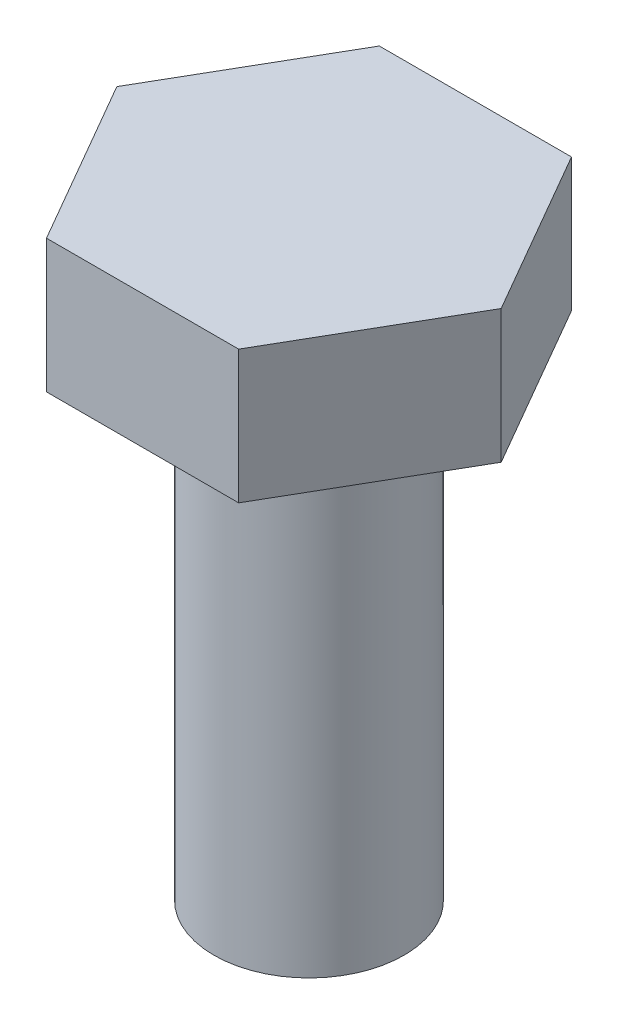
ISO-10303-21;
HEADER;
FILE_DESCRIPTION(('STEP AP214'),'2;1');
FILE_NAME('part.step','',(''),(''),'','','');
FILE_SCHEMA(('AUTOMOTIVE_DESIGN { 1 0 10303 214 1 1 1 1 }'));
ENDSEC;
DATA;
#1=APPLICATION_CONTEXT('core data for automotive mechanical design processes');
#2=APPLICATION_PROTOCOL_DEFINITION('international standard','automotive_design',2000,#1);
#3=PRODUCT_CONTEXT('',#1,'mechanical');
#4=PRODUCT('Part','Part','',(#3));
#5=PRODUCT_RELATED_PRODUCT_CATEGORY('part','',(#4));
#6=PRODUCT_DEFINITION_FORMATION('','',#4);
#7=PRODUCT_DEFINITION_CONTEXT('part definition',#1,'design');
#8=PRODUCT_DEFINITION('design','',#6,#7);
#9=PRODUCT_DEFINITION_SHAPE('','',#8);
#10=(LENGTH_UNIT() NAMED_UNIT(*) SI_UNIT(.MILLI.,.METRE.));
#11=(NAMED_UNIT(*) PLANE_ANGLE_UNIT() SI_UNIT($,.RADIAN.));
#12=(NAMED_UNIT(*) SI_UNIT($,.STERADIAN.) SOLID_ANGLE_UNIT());
#13=UNCERTAINTY_MEASURE_WITH_UNIT(LENGTH_MEASURE(1.E-05),#10,'distance_accuracy_value','');
#14=(GEOMETRIC_REPRESENTATION_CONTEXT(3) GLOBAL_UNCERTAINTY_ASSIGNED_CONTEXT((#13)) GLOBAL_UNIT_ASSIGNED_CONTEXT((#10,
#11,#12)) REPRESENTATION_CONTEXT('',''));
#15=CARTESIAN_POINT('',(0.,0.,0.));
#16=DIRECTION('',(0.,0.,1.));
#17=DIRECTION('',(1.,0.,0.));
#18=AXIS2_PLACEMENT_3D('',#15,#16,#17);
#19=CARTESIAN_POINT('',(0.,10.,0.));
#20=DIRECTION('',(0.,-1.,0.));
#21=DIRECTION('',(0.,0.,-1.));
#22=AXIS2_PLACEMENT_3D('',#19,#20,#21);
#23=CYLINDRICAL_SURFACE('',#22,2.);
#24=CARTESIAN_POINT('',(0.,10.,0.));
#25=DIRECTION('',(0.,1.,0.));
#26=DIRECTION('',(0.,0.,1.));
#27=AXIS2_PLACEMENT_3D('',#24,#25,#26);
#28=CIRCLE('',#27,2.);
#29=CARTESIAN_POINT('',(0.,10.,2.));
#30=VERTEX_POINT('',#29);
#31=EDGE_CURVE('E11',#30,#30,#28,.T.);
#32=ORIENTED_EDGE('',*,*,#31,.F.);
#33=EDGE_LOOP('',(#32));
#34=FACE_BOUND('',#33,.T.);
#35=CARTESIAN_POINT('',(0.,0.,0.));
#36=DIRECTION('',(0.,1.,0.));
#37=DIRECTION('',(0.,0.,1.));
#38=AXIS2_PLACEMENT_3D('',#35,#36,#37);
#39=CIRCLE('',#38,2.);
#40=CARTESIAN_POINT('',(0.,0.,2.));
#41=VERTEX_POINT('',#40);
#42=EDGE_CURVE('E37',#41,#41,#39,.T.);
#43=ORIENTED_EDGE('',*,*,#42,.T.);
#44=EDGE_LOOP('',(#43));
#45=FACE_BOUND('',#44,.T.);
#46=ADVANCED_FACE('F34',(#34,#45),#23,.T.);
#47=CARTESIAN_POINT('',(0.,0.,0.));
#48=DIRECTION('',(0.,1.,0.));
#49=DIRECTION('',(0.,0.,1.));
#50=AXIS2_PLACEMENT_3D('',#47,#48,#49);
#51=PLANE('',#50);
#52=ORIENTED_EDGE('',*,*,#42,.F.);
#53=EDGE_LOOP('',(#52));
#54=FACE_BOUND('',#53,.T.);
#55=ADVANCED_FACE('F142',(#54),#51,.F.);
#56=CARTESIAN_POINT('',(2.02072594216369,12.8,3.5));
#57=DIRECTION('',(-0.866025403784439,0.,-0.5));
#58=DIRECTION('',(-0.5,0.,0.866025403784439));
#59=AXIS2_PLACEMENT_3D('',#56,#57,#58);
#60=PLANE('',#59);
#61=DIRECTION('',(0.5,0.,-0.866025403784439));
#62=VECTOR('',#61,1.);
#63=CARTESIAN_POINT('',(2.02072594216369,10.,3.5));
#64=LINE('',#63,#62);
#65=CARTESIAN_POINT('',(2.02072594216369,10.,3.5));
#66=VERTEX_POINT('',#65);
#67=CARTESIAN_POINT('',(4.04145188432738,10.,0.));
#68=VERTEX_POINT('',#67);
#69=EDGE_CURVE('E119',#66,#68,#64,.T.);
#70=ORIENTED_EDGE('',*,*,#69,.T.);
#71=DIRECTION('',(0.,-1.,0.));
#72=VECTOR('',#71,1.);
#73=CARTESIAN_POINT('',(4.04145188432738,12.8,0.));
#74=LINE('',#73,#72);
#75=CARTESIAN_POINT('',(4.04145188432738,12.8,0.));
#76=VERTEX_POINT('',#75);
#77=EDGE_CURVE('E136',#76,#68,#74,.T.);
#78=ORIENTED_EDGE('',*,*,#77,.F.);
#79=DIRECTION('',(0.5,0.,-0.866025403784439));
#80=VECTOR('',#79,1.);
#81=CARTESIAN_POINT('',(2.02072594216369,12.8,3.5));
#82=LINE('',#81,#80);
#83=CARTESIAN_POINT('',(2.02072594216369,12.8,3.5));
#84=VERTEX_POINT('',#83);
#85=EDGE_CURVE('E129',#84,#76,#82,.T.);
#86=ORIENTED_EDGE('',*,*,#85,.F.);
#87=DIRECTION('',(0.,-1.,0.));
#88=VECTOR('',#87,1.);
#89=CARTESIAN_POINT('',(2.02072594216369,12.8,3.5));
#90=LINE('',#89,#88);
#91=EDGE_CURVE('E115',#84,#66,#90,.T.);
#92=ORIENTED_EDGE('',*,*,#91,.T.);
#93=EDGE_LOOP('',(#70,#78,#86,#92));
#94=FACE_BOUND('',#93,.T.);
#95=ADVANCED_FACE('F144',(#94),#60,.F.);
#96=CARTESIAN_POINT('',(4.04145188432738,12.8,0.));
#97=DIRECTION('',(-0.866025403784438,0.,0.5));
#98=DIRECTION('',(0.5,0.,0.866025403784438));
#99=AXIS2_PLACEMENT_3D('',#96,#97,#98);
#100=PLANE('',#99);
#101=DIRECTION('',(-0.5,0.,-0.866025403784438));
#102=VECTOR('',#101,1.);
#103=CARTESIAN_POINT('',(4.04145188432738,10.,0.));
#104=LINE('',#103,#102);
#105=CARTESIAN_POINT('',(2.02072594216369,10.,-3.5));
#106=VERTEX_POINT('',#105);
#107=EDGE_CURVE('E122',#68,#106,#104,.T.);
#108=ORIENTED_EDGE('',*,*,#107,.T.);
#109=DIRECTION('',(0.,-1.,0.));
#110=VECTOR('',#109,1.);
#111=CARTESIAN_POINT('',(2.02072594216369,12.8,-3.5));
#112=LINE('',#111,#110);
#113=CARTESIAN_POINT('',(2.02072594216369,12.8,-3.5));
#114=VERTEX_POINT('',#113);
#115=EDGE_CURVE('E133',#114,#106,#112,.T.);
#116=ORIENTED_EDGE('',*,*,#115,.F.);
#117=DIRECTION('',(-0.5,0.,-0.866025403784438));
#118=VECTOR('',#117,1.);
#119=CARTESIAN_POINT('',(4.04145188432738,12.8,0.));
#120=LINE('',#119,#118);
#121=EDGE_CURVE('E88',#76,#114,#120,.T.);
#122=ORIENTED_EDGE('',*,*,#121,.F.);
#123=ORIENTED_EDGE('',*,*,#77,.T.);
#124=EDGE_LOOP('',(#108,#116,#122,#123));
#125=FACE_BOUND('',#124,.T.);
#126=ADVANCED_FACE('F149',(#125),#100,.F.);
#127=CARTESIAN_POINT('',(2.02072594216369,12.8,-3.5));
#128=DIRECTION('',(0.,0.,1.));
#129=DIRECTION('',(1.,0.,0.));
#130=AXIS2_PLACEMENT_3D('',#127,#128,#129);
#131=PLANE('',#130);
#132=DIRECTION('',(-1.,0.,0.));
#133=VECTOR('',#132,1.);
#134=CARTESIAN_POINT('',(2.02072594216369,10.,-3.5));
#135=LINE('',#134,#133);
#136=CARTESIAN_POINT('',(-2.02072594216369,10.,-3.5));
#137=VERTEX_POINT('',#136);
#138=EDGE_CURVE('E124',#106,#137,#135,.T.);
#139=ORIENTED_EDGE('',*,*,#138,.T.);
#140=DIRECTION('',(0.,-1.,0.));
#141=VECTOR('',#140,1.);
#142=CARTESIAN_POINT('',(-2.02072594216369,12.8,-3.5));
#143=LINE('',#142,#141);
#144=CARTESIAN_POINT('',(-2.02072594216369,12.8,-3.5));
#145=VERTEX_POINT('',#144);
#146=EDGE_CURVE('E110',#145,#137,#143,.T.);
#147=ORIENTED_EDGE('',*,*,#146,.F.);
#148=DIRECTION('',(-1.,0.,0.));
#149=VECTOR('',#148,1.);
#150=CARTESIAN_POINT('',(2.02072594216369,12.8,-3.5));
#151=LINE('',#150,#149);
#152=EDGE_CURVE('E101',#114,#145,#151,.T.);
#153=ORIENTED_EDGE('',*,*,#152,.F.);
#154=ORIENTED_EDGE('',*,*,#115,.T.);
#155=EDGE_LOOP('',(#139,#147,#153,#154));
#156=FACE_BOUND('',#155,.T.);
#157=ADVANCED_FACE('F156',(#156),#131,.F.);
#158=CARTESIAN_POINT('',(-2.02072594216369,12.8,-3.5));
#159=DIRECTION('',(0.866025403784439,0.,0.5));
#160=DIRECTION('',(0.5,0.,-0.866025403784439));
#161=AXIS2_PLACEMENT_3D('',#158,#159,#160);
#162=PLANE('',#161);
#163=DIRECTION('',(-0.5,0.,0.866025403784439));
#164=VECTOR('',#163,1.);
#165=CARTESIAN_POINT('',(-2.02072594216369,10.,-3.5));
#166=LINE('',#165,#164);
#167=CARTESIAN_POINT('',(-4.04145188432738,10.,0.));
#168=VERTEX_POINT('',#167);
#169=EDGE_CURVE('E109',#137,#168,#166,.T.);
#170=ORIENTED_EDGE('',*,*,#169,.T.);
#171=DIRECTION('',(0.,-1.,0.));
#172=VECTOR('',#171,1.);
#173=CARTESIAN_POINT('',(-4.04145188432738,12.8,0.));
#174=LINE('',#173,#172);
#175=CARTESIAN_POINT('',(-4.04145188432738,12.8,0.));
#176=VERTEX_POINT('',#175);
#177=EDGE_CURVE('E106',#176,#168,#174,.T.);
#178=ORIENTED_EDGE('',*,*,#177,.F.);
#179=DIRECTION('',(-0.5,0.,0.866025403784439));
#180=VECTOR('',#179,1.);
#181=CARTESIAN_POINT('',(-2.02072594216369,12.8,-3.5));
#182=LINE('',#181,#180);
#183=EDGE_CURVE('E95',#145,#176,#182,.T.);
#184=ORIENTED_EDGE('',*,*,#183,.F.);
#185=ORIENTED_EDGE('',*,*,#146,.T.);
#186=EDGE_LOOP('',(#170,#178,#184,#185));
#187=FACE_BOUND('',#186,.T.);
#188=ADVANCED_FACE('F107',(#187),#162,.F.);
#189=CARTESIAN_POINT('',(-4.04145188432738,12.8,0.));
#190=DIRECTION('',(0.866025403784439,0.,-0.5));
#191=DIRECTION('',(-0.5,0.,-0.866025403784439));
#192=AXIS2_PLACEMENT_3D('',#189,#190,#191);
#193=PLANE('',#192);
#194=DIRECTION('',(0.5,0.,0.866025403784439));
#195=VECTOR('',#194,1.);
#196=CARTESIAN_POINT('',(-4.04145188432738,10.,0.));
#197=LINE('',#196,#195);
#198=CARTESIAN_POINT('',(-2.02072594216369,10.,3.5));
#199=VERTEX_POINT('',#198);
#200=EDGE_CURVE('E73',#168,#199,#197,.T.);
#201=ORIENTED_EDGE('',*,*,#200,.T.);
#202=DIRECTION('',(0.,-1.,0.));
#203=VECTOR('',#202,1.);
#204=CARTESIAN_POINT('',(-2.02072594216369,12.8,3.5));
#205=LINE('',#204,#203);
#206=CARTESIAN_POINT('',(-2.02072594216369,12.8,3.5));
#207=VERTEX_POINT('',#206);
#208=EDGE_CURVE('E111',#207,#199,#205,.T.);
#209=ORIENTED_EDGE('',*,*,#208,.F.);
#210=DIRECTION('',(0.5,0.,0.866025403784439));
#211=VECTOR('',#210,1.);
#212=CARTESIAN_POINT('',(-4.04145188432738,12.8,0.));
#213=LINE('',#212,#211);
#214=EDGE_CURVE('E99',#176,#207,#213,.T.);
#215=ORIENTED_EDGE('',*,*,#214,.F.);
#216=ORIENTED_EDGE('',*,*,#177,.T.);
#217=EDGE_LOOP('',(#201,#209,#215,#216));
#218=FACE_BOUND('',#217,.T.);
#219=ADVANCED_FACE('F113',(#218),#193,.F.);
#220=CARTESIAN_POINT('',(-2.02072594216369,12.8,3.5));
#221=DIRECTION('',(0.,0.,-1.));
#222=DIRECTION('',(-1.,0.,0.));
#223=AXIS2_PLACEMENT_3D('',#220,#221,#222);
#224=PLANE('',#223);
#225=DIRECTION('',(1.,0.,0.));
#226=VECTOR('',#225,1.);
#227=CARTESIAN_POINT('',(-2.02072594216369,10.,3.5));
#228=LINE('',#227,#226);
#229=EDGE_CURVE('E79',#199,#66,#228,.T.);
#230=ORIENTED_EDGE('',*,*,#229,.T.);
#231=ORIENTED_EDGE('',*,*,#91,.F.);
#232=DIRECTION('',(1.,0.,0.));
#233=VECTOR('',#232,1.);
#234=CARTESIAN_POINT('',(-2.02072594216369,12.8,3.5));
#235=LINE('',#234,#233);
#236=EDGE_CURVE('E50',#207,#84,#235,.T.);
#237=ORIENTED_EDGE('',*,*,#236,.F.);
#238=ORIENTED_EDGE('',*,*,#208,.T.);
#239=EDGE_LOOP('',(#230,#231,#237,#238));
#240=FACE_BOUND('',#239,.T.);
#241=ADVANCED_FACE('F164',(#240),#224,.F.);
#242=CARTESIAN_POINT('',(0.,12.8,0.));
#243=DIRECTION('',(0.,1.,0.));
#244=DIRECTION('',(0.,0.,1.));
#245=AXIS2_PLACEMENT_3D('',#242,#243,#244);
#246=PLANE('',#245);
#247=ORIENTED_EDGE('',*,*,#85,.T.);
#248=ORIENTED_EDGE('',*,*,#121,.T.);
#249=ORIENTED_EDGE('',*,*,#152,.T.);
#250=ORIENTED_EDGE('',*,*,#183,.T.);
#251=ORIENTED_EDGE('',*,*,#214,.T.);
#252=ORIENTED_EDGE('',*,*,#236,.T.);
#253=EDGE_LOOP('',(#247,#248,#249,#250,#251,#252));
#254=FACE_BOUND('',#253,.T.);
#255=ADVANCED_FACE('F97',(#254),#246,.T.);
#256=CARTESIAN_POINT('',(0.,10.,0.));
#257=DIRECTION('',(0.,1.,0.));
#258=DIRECTION('',(0.,0.,1.));
#259=AXIS2_PLACEMENT_3D('',#256,#257,#258);
#260=PLANE('',#259);
#261=ORIENTED_EDGE('',*,*,#31,.T.);
#262=EDGE_LOOP('',(#261));
#263=FACE_BOUND('',#262,.T.);
#264=ORIENTED_EDGE('',*,*,#69,.F.);
#265=ORIENTED_EDGE('',*,*,#229,.F.);
#266=ORIENTED_EDGE('',*,*,#200,.F.);
#267=ORIENTED_EDGE('',*,*,#169,.F.);
#268=ORIENTED_EDGE('',*,*,#138,.F.);
#269=ORIENTED_EDGE('',*,*,#107,.F.);
#270=EDGE_LOOP('',(#264,#265,#266,#267,#268,#269));
#271=FACE_BOUND('',#270,.T.);
#272=ADVANCED_FACE('F167',(#263,#271),#260,.F.);
#273=CLOSED_SHELL('',(#46,#55,#95,#126,#157,#188,#219,#241,#255,#272));
#274=MANIFOLD_SOLID_BREP('B2',#273);
#275=ADVANCED_BREP_SHAPE_REPRESENTATION('',(#18,#274),#14);
#276=SHAPE_DEFINITION_REPRESENTATION(#9,#275);
ENDSEC;
END-ISO-10303-21;
